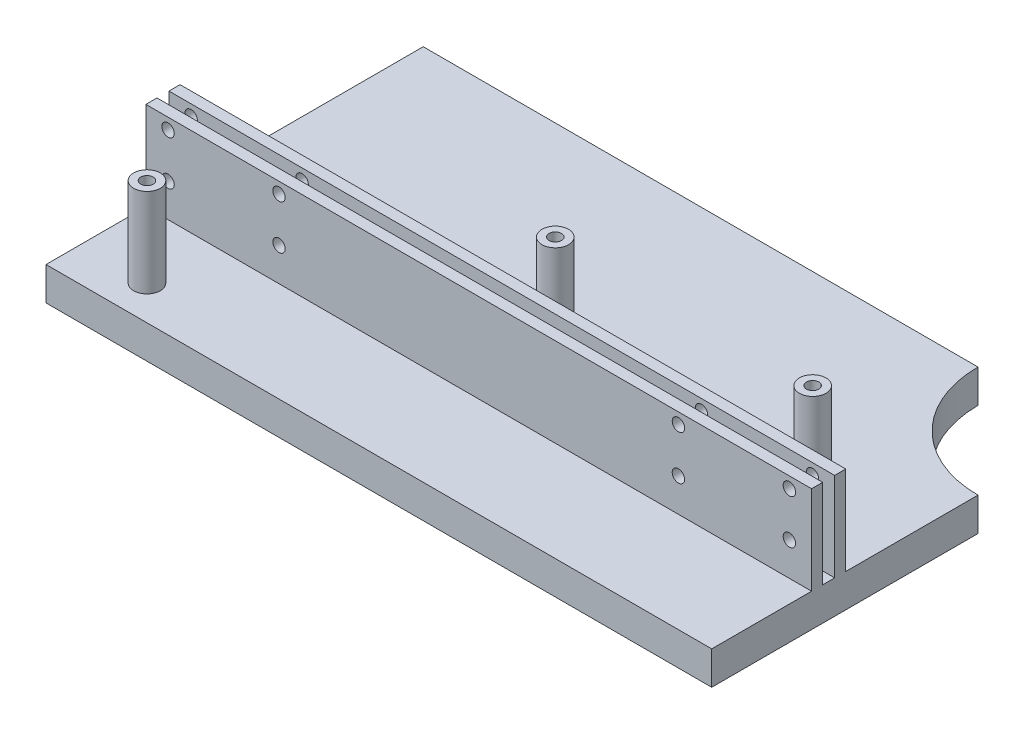
ISO-10303-21;
HEADER;
FILE_DESCRIPTION(('STEP AP214'),'2;1');
FILE_NAME('part.step','',(''),(''),'','','');
FILE_SCHEMA(('AUTOMOTIVE_DESIGN { 1 0 10303 214 1 1 1 1 }'));
ENDSEC;
DATA;
#1=APPLICATION_CONTEXT('core data for automotive mechanical design processes');
#2=APPLICATION_PROTOCOL_DEFINITION('international standard','automotive_design',2000,#1);
#3=PRODUCT_CONTEXT('',#1,'mechanical');
#4=PRODUCT('Part','Part','',(#3));
#5=PRODUCT_RELATED_PRODUCT_CATEGORY('part','',(#4));
#6=PRODUCT_DEFINITION_FORMATION('','',#4);
#7=PRODUCT_DEFINITION_CONTEXT('part definition',#1,'design');
#8=PRODUCT_DEFINITION('design','',#6,#7);
#9=PRODUCT_DEFINITION_SHAPE('','',#8);
#10=(LENGTH_UNIT() NAMED_UNIT(*) SI_UNIT(.MILLI.,.METRE.));
#11=(NAMED_UNIT(*) PLANE_ANGLE_UNIT() SI_UNIT($,.RADIAN.));
#12=(NAMED_UNIT(*) SI_UNIT($,.STERADIAN.) SOLID_ANGLE_UNIT());
#13=UNCERTAINTY_MEASURE_WITH_UNIT(LENGTH_MEASURE(1.E-05),#10,'distance_accuracy_value','');
#14=(GEOMETRIC_REPRESENTATION_CONTEXT(3) GLOBAL_UNCERTAINTY_ASSIGNED_CONTEXT((#13)) GLOBAL_UNIT_ASSIGNED_CONTEXT((#10,
#11,#12)) REPRESENTATION_CONTEXT('',''));
#15=CARTESIAN_POINT('',(0.,0.,0.));
#16=DIRECTION('',(0.,0.,1.));
#17=DIRECTION('',(1.,0.,0.));
#18=AXIS2_PLACEMENT_3D('',#15,#16,#17);
#19=CARTESIAN_POINT('',(0.,7.5,-85.));
#20=DIRECTION('',(0.,1.,0.));
#21=DIRECTION('',(0.,0.,1.));
#22=AXIS2_PLACEMENT_3D('',#19,#20,#21);
#23=PLANE('',#22);
#24=CARTESIAN_POINT('',(-135.,7.5,-7.75));
#25=DIRECTION('',(0.,1.,0.));
#26=DIRECTION('',(0.,0.,1.));
#27=AXIS2_PLACEMENT_3D('',#24,#25,#26);
#28=CIRCLE('',#27,2.99999999999999);
#29=CARTESIAN_POINT('',(-135.,7.5,-4.75000000000001));
#30=VERTEX_POINT('',#29);
#31=EDGE_CURVE('E639',#30,#30,#28,.T.);
#32=ORIENTED_EDGE('',*,*,#31,.F.);
#33=EDGE_LOOP('',(#32));
#34=FACE_BOUND('',#33,.T.);
#35=DIRECTION('',(1.,0.,0.));
#36=VECTOR('',#35,1.);
#37=CARTESIAN_POINT('',(0.,7.5,-22.5));
#38=LINE('',#37,#36);
#39=CARTESIAN_POINT('',(-150.,7.5,-22.5));
#40=VERTEX_POINT('',#39);
#41=CARTESIAN_POINT('',(0.,7.5,-22.5));
#42=VERTEX_POINT('',#41);
#43=EDGE_CURVE('E153',#40,#42,#38,.T.);
#44=ORIENTED_EDGE('',*,*,#43,.F.);
#45=DIRECTION('',(0.,0.,1.));
#46=VECTOR('',#45,1.);
#47=CARTESIAN_POINT('',(-150.,7.5,-85.));
#48=LINE('',#47,#46);
#49=CARTESIAN_POINT('',(-150.,7.5,0.));
#50=VERTEX_POINT('',#49);
#51=EDGE_CURVE('E196',#40,#50,#48,.T.);
#52=ORIENTED_EDGE('',*,*,#51,.T.);
#53=DIRECTION('',(1.,0.,0.));
#54=VECTOR('',#53,1.);
#55=CARTESIAN_POINT('',(-150.,7.5,0.));
#56=LINE('',#55,#54);
#57=CARTESIAN_POINT('',(0.,7.5,0.));
#58=VERTEX_POINT('',#57);
#59=EDGE_CURVE('E194',#50,#58,#56,.T.);
#60=ORIENTED_EDGE('',*,*,#59,.T.);
#61=DIRECTION('',(0.,0.,-1.));
#62=VECTOR('',#61,1.);
#63=CARTESIAN_POINT('',(0.,7.5,-60.));
#64=LINE('',#63,#62);
#65=EDGE_CURVE('E199',#58,#42,#64,.T.);
#66=ORIENTED_EDGE('',*,*,#65,.T.);
#67=EDGE_LOOP('',(#44,#52,#60,#66));
#68=FACE_BOUND('',#67,.T.);
#69=ADVANCED_FACE('F39',(#34,#68),#23,.T.);
#70=CARTESIAN_POINT('',(-20.,7.5,-42.75));
#71=DIRECTION('',(0.,1.,0.));
#72=DIRECTION('',(0.,0.,1.));
#73=AXIS2_PLACEMENT_3D('',#70,#71,#72);
#74=CIRCLE('',#73,3.);
#75=CARTESIAN_POINT('',(-20.,7.5,-39.75));
#76=VERTEX_POINT('',#75);
#77=EDGE_CURVE('E652',#76,#76,#74,.T.);
#78=ORIENTED_EDGE('',*,*,#77,.F.);
#79=EDGE_LOOP('',(#78));
#80=FACE_BOUND('',#79,.T.);
#81=CARTESIAN_POINT('',(-78.,7.5,-42.75));
#82=DIRECTION('',(0.,1.,0.));
#83=DIRECTION('',(0.,0.,1.));
#84=AXIS2_PLACEMENT_3D('',#81,#82,#83);
#85=CIRCLE('',#84,3.00000000000001);
#86=CARTESIAN_POINT('',(-78.,7.5,-39.75));
#87=VERTEX_POINT('',#86);
#88=EDGE_CURVE('E655',#87,#87,#85,.T.);
#89=ORIENTED_EDGE('',*,*,#88,.F.);
#90=EDGE_LOOP('',(#89));
#91=FACE_BOUND('',#90,.T.);
#92=DIRECTION('',(-1.,0.,0.));
#93=VECTOR('',#92,1.);
#94=CARTESIAN_POINT('',(-150.,7.5,-30.2));
#95=LINE('',#94,#93);
#96=CARTESIAN_POINT('',(0.,7.5,-30.2));
#97=VERTEX_POINT('',#96);
#98=CARTESIAN_POINT('',(-150.,7.5,-30.2));
#99=VERTEX_POINT('',#98);
#100=EDGE_CURVE('E54',#97,#99,#95,.T.);
#101=ORIENTED_EDGE('',*,*,#100,.F.);
#102=CARTESIAN_POINT('',(0.,7.5,-60.));
#103=VERTEX_POINT('',#102);
#104=EDGE_CURVE('E198',#97,#103,#64,.T.);
#105=ORIENTED_EDGE('',*,*,#104,.T.);
#106=CARTESIAN_POINT('',(0.,7.5,-85.));
#107=DIRECTION('',(0.,-1.,0.));
#108=DIRECTION('',(0.,0.,1.));
#109=AXIS2_PLACEMENT_3D('',#106,#107,#108);
#110=CIRCLE('',#109,25.);
#111=CARTESIAN_POINT('',(-25.,7.5,-85.));
#112=VERTEX_POINT('',#111);
#113=EDGE_CURVE('E201',#103,#112,#110,.T.);
#114=ORIENTED_EDGE('',*,*,#113,.T.);
#115=DIRECTION('',(-1.,0.,0.));
#116=VECTOR('',#115,1.);
#117=CARTESIAN_POINT('',(-150.,7.5,-85.));
#118=LINE('',#117,#116);
#119=CARTESIAN_POINT('',(-150.,7.5,-85.));
#120=VERTEX_POINT('',#119);
#121=EDGE_CURVE('E203',#112,#120,#118,.T.);
#122=ORIENTED_EDGE('',*,*,#121,.T.);
#123=EDGE_CURVE('E192',#120,#99,#48,.T.);
#124=ORIENTED_EDGE('',*,*,#123,.T.);
#125=EDGE_LOOP('',(#101,#105,#114,#122,#124));
#126=FACE_BOUND('',#125,.T.);
#127=ADVANCED_FACE('F241',(#80,#91,#126),#23,.T.);
#128=CARTESIAN_POINT('',(-150.,7.5,-85.));
#129=DIRECTION('',(1.,0.,0.));
#130=DIRECTION('',(0.,0.,-1.));
#131=AXIS2_PLACEMENT_3D('',#128,#129,#130);
#132=PLANE('',#131);
#133=DIRECTION('',(0.,0.,1.));
#134=VECTOR('',#133,1.);
#135=CARTESIAN_POINT('',(-150.,0.,-85.));
#136=LINE('',#135,#134);
#137=CARTESIAN_POINT('',(-150.,0.,-85.));
#138=VERTEX_POINT('',#137);
#139=CARTESIAN_POINT('',(-150.,0.,0.));
#140=VERTEX_POINT('',#139);
#141=EDGE_CURVE('E158',#138,#140,#136,.T.);
#142=ORIENTED_EDGE('',*,*,#141,.T.);
#143=DIRECTION('',(0.,-1.,0.));
#144=VECTOR('',#143,1.);
#145=CARTESIAN_POINT('',(-150.,7.5,0.));
#146=LINE('',#145,#144);
#147=EDGE_CURVE('E11',#50,#140,#146,.T.);
#148=ORIENTED_EDGE('',*,*,#147,.F.);
#149=ORIENTED_EDGE('',*,*,#51,.F.);
#150=DIRECTION('',(0.,-1.,0.));
#151=VECTOR('',#150,1.);
#152=CARTESIAN_POINT('',(-150.,27.5,-22.5));
#153=LINE('',#152,#151);
#154=CARTESIAN_POINT('',(-150.,27.5,-22.5));
#155=VERTEX_POINT('',#154);
#156=EDGE_CURVE('E163',#155,#40,#153,.T.);
#157=ORIENTED_EDGE('',*,*,#156,.F.);
#158=DIRECTION('',(0.,0.,1.));
#159=VECTOR('',#158,1.);
#160=CARTESIAN_POINT('',(-150.,27.5,-25.));
#161=LINE('',#160,#159);
#162=CARTESIAN_POINT('',(-150.,27.5,-25.));
#163=VERTEX_POINT('',#162);
#164=EDGE_CURVE('E143',#163,#155,#161,.T.);
#165=ORIENTED_EDGE('',*,*,#164,.F.);
#166=DIRECTION('',(0.,-1.,0.));
#167=VECTOR('',#166,1.);
#168=CARTESIAN_POINT('',(-150.,27.5,-25.));
#169=LINE('',#168,#167);
#170=CARTESIAN_POINT('',(-150.,7.5,-25.));
#171=VERTEX_POINT('',#170);
#172=EDGE_CURVE('E140',#163,#171,#169,.T.);
#173=ORIENTED_EDGE('',*,*,#172,.T.);
#174=CARTESIAN_POINT('',(-150.,7.5,-27.7));
#175=VERTEX_POINT('',#174);
#176=EDGE_CURVE('E195',#175,#171,#48,.T.);
#177=ORIENTED_EDGE('',*,*,#176,.F.);
#178=DIRECTION('',(0.,-1.,0.));
#179=VECTOR('',#178,1.);
#180=CARTESIAN_POINT('',(-150.,27.5,-27.7));
#181=LINE('',#180,#179);
#182=CARTESIAN_POINT('',(-150.,27.5,-27.7));
#183=VERTEX_POINT('',#182);
#184=EDGE_CURVE('E167',#183,#175,#181,.T.);
#185=ORIENTED_EDGE('',*,*,#184,.F.);
#186=DIRECTION('',(0.,0.,1.));
#187=VECTOR('',#186,1.);
#188=CARTESIAN_POINT('',(-150.,27.5,-27.7));
#189=LINE('',#188,#187);
#190=CARTESIAN_POINT('',(-150.,27.5,-30.2));
#191=VERTEX_POINT('',#190);
#192=EDGE_CURVE('E182',#191,#183,#189,.T.);
#193=ORIENTED_EDGE('',*,*,#192,.F.);
#194=DIRECTION('',(0.,-1.,0.));
#195=VECTOR('',#194,1.);
#196=CARTESIAN_POINT('',(-150.,27.5,-30.2));
#197=LINE('',#196,#195);
#198=EDGE_CURVE('E176',#191,#99,#197,.T.);
#199=ORIENTED_EDGE('',*,*,#198,.T.);
#200=ORIENTED_EDGE('',*,*,#123,.F.);
#201=DIRECTION('',(0.,-1.,0.));
#202=VECTOR('',#201,1.);
#203=CARTESIAN_POINT('',(-150.,7.5,-85.));
#204=LINE('',#203,#202);
#205=EDGE_CURVE('E204',#120,#138,#204,.T.);
#206=ORIENTED_EDGE('',*,*,#205,.T.);
#207=EDGE_LOOP('',(#142,#148,#149,#157,#165,#173,#177,#185,#193,#199,#200,#206));
#208=FACE_BOUND('',#207,.T.);
#209=ADVANCED_FACE('F41',(#208),#132,.F.);
#210=CARTESIAN_POINT('',(-150.,7.5,0.));
#211=DIRECTION('',(0.,0.,-1.));
#212=DIRECTION('',(-1.,0.,0.));
#213=AXIS2_PLACEMENT_3D('',#210,#211,#212);
#214=PLANE('',#213);
#215=DIRECTION('',(1.,0.,0.));
#216=VECTOR('',#215,1.);
#217=CARTESIAN_POINT('',(-150.,0.,0.));
#218=LINE('',#217,#216);
#219=CARTESIAN_POINT('',(0.,0.,0.));
#220=VERTEX_POINT('',#219);
#221=EDGE_CURVE('E161',#140,#220,#218,.T.);
#222=ORIENTED_EDGE('',*,*,#221,.T.);
#223=DIRECTION('',(0.,-1.,0.));
#224=VECTOR('',#223,1.);
#225=CARTESIAN_POINT('',(0.,7.5,0.));
#226=LINE('',#225,#224);
#227=EDGE_CURVE('E47',#58,#220,#226,.T.);
#228=ORIENTED_EDGE('',*,*,#227,.F.);
#229=ORIENTED_EDGE('',*,*,#59,.F.);
#230=ORIENTED_EDGE('',*,*,#147,.T.);
#231=EDGE_LOOP('',(#222,#228,#229,#230));
#232=FACE_BOUND('',#231,.T.);
#233=ADVANCED_FACE('F262',(#232),#214,.F.);
#234=CARTESIAN_POINT('',(0.,7.5,-60.));
#235=DIRECTION('',(-1.,0.,0.));
#236=DIRECTION('',(0.,0.,1.));
#237=AXIS2_PLACEMENT_3D('',#234,#235,#236);
#238=PLANE('',#237);
#239=DIRECTION('',(0.,0.,-1.));
#240=VECTOR('',#239,1.);
#241=CARTESIAN_POINT('',(0.,0.,-60.));
#242=LINE('',#241,#240);
#243=CARTESIAN_POINT('',(0.,0.,-60.));
#244=VERTEX_POINT('',#243);
#245=EDGE_CURVE('E207',#220,#244,#242,.T.);
#246=ORIENTED_EDGE('',*,*,#245,.T.);
#247=DIRECTION('',(0.,-1.,0.));
#248=VECTOR('',#247,1.);
#249=CARTESIAN_POINT('',(0.,7.5,-60.));
#250=LINE('',#249,#248);
#251=EDGE_CURVE('E218',#103,#244,#250,.T.);
#252=ORIENTED_EDGE('',*,*,#251,.F.);
#253=ORIENTED_EDGE('',*,*,#104,.F.);
#254=DIRECTION('',(0.,-1.,0.));
#255=VECTOR('',#254,1.);
#256=CARTESIAN_POINT('',(0.,27.5,-30.2));
#257=LINE('',#256,#255);
#258=CARTESIAN_POINT('',(0.,27.5,-30.2));
#259=VERTEX_POINT('',#258);
#260=EDGE_CURVE('E173',#259,#97,#257,.T.);
#261=ORIENTED_EDGE('',*,*,#260,.F.);
#262=DIRECTION('',(0.,0.,-1.));
#263=VECTOR('',#262,1.);
#264=CARTESIAN_POINT('',(0.,27.5,-27.7));
#265=LINE('',#264,#263);
#266=CARTESIAN_POINT('',(0.,27.5,-27.7));
#267=VERTEX_POINT('',#266);
#268=EDGE_CURVE('E186',#267,#259,#265,.T.);
#269=ORIENTED_EDGE('',*,*,#268,.F.);
#270=DIRECTION('',(0.,-1.,0.));
#271=VECTOR('',#270,1.);
#272=CARTESIAN_POINT('',(0.,27.5,-27.7));
#273=LINE('',#272,#271);
#274=CARTESIAN_POINT('',(0.,7.5,-27.7));
#275=VERTEX_POINT('',#274);
#276=EDGE_CURVE('E170',#267,#275,#273,.T.);
#277=ORIENTED_EDGE('',*,*,#276,.T.);
#278=CARTESIAN_POINT('',(0.,7.5,-25.));
#279=VERTEX_POINT('',#278);
#280=EDGE_CURVE('E157',#279,#275,#64,.T.);
#281=ORIENTED_EDGE('',*,*,#280,.F.);
#282=DIRECTION('',(0.,-1.,0.));
#283=VECTOR('',#282,1.);
#284=CARTESIAN_POINT('',(0.,27.5,-25.));
#285=LINE('',#284,#283);
#286=CARTESIAN_POINT('',(0.,27.5,-25.));
#287=VERTEX_POINT('',#286);
#288=EDGE_CURVE('E138',#287,#279,#285,.T.);
#289=ORIENTED_EDGE('',*,*,#288,.F.);
#290=DIRECTION('',(0.,0.,-1.));
#291=VECTOR('',#290,1.);
#292=CARTESIAN_POINT('',(0.,27.5,-25.));
#293=LINE('',#292,#291);
#294=CARTESIAN_POINT('',(0.,27.5,-22.5));
#295=VERTEX_POINT('',#294);
#296=EDGE_CURVE('E144',#295,#287,#293,.T.);
#297=ORIENTED_EDGE('',*,*,#296,.F.);
#298=DIRECTION('',(0.,-1.,0.));
#299=VECTOR('',#298,1.);
#300=CARTESIAN_POINT('',(0.,27.5,-22.5));
#301=LINE('',#300,#299);
#302=EDGE_CURVE('E758',#295,#42,#301,.T.);
#303=ORIENTED_EDGE('',*,*,#302,.T.);
#304=ORIENTED_EDGE('',*,*,#65,.F.);
#305=ORIENTED_EDGE('',*,*,#227,.T.);
#306=EDGE_LOOP('',(#246,#252,#253,#261,#269,#277,#281,#289,#297,#303,#304,#305));
#307=FACE_BOUND('',#306,.T.);
#308=ADVANCED_FACE('F155',(#307),#238,.F.);
#309=CARTESIAN_POINT('',(0.,7.5,-85.));
#310=DIRECTION('',(0.,-1.,0.));
#311=DIRECTION('',(0.,0.,-1.));
#312=AXIS2_PLACEMENT_3D('',#309,#310,#311);
#313=CYLINDRICAL_SURFACE('',#312,25.);
#314=CARTESIAN_POINT('',(0.,0.,-85.));
#315=DIRECTION('',(0.,-1.,0.));
#316=DIRECTION('',(0.,0.,1.));
#317=AXIS2_PLACEMENT_3D('',#314,#315,#316);
#318=CIRCLE('',#317,25.);
#319=CARTESIAN_POINT('',(-25.,0.,-85.));
#320=VERTEX_POINT('',#319);
#321=EDGE_CURVE('E209',#244,#320,#318,.T.);
#322=ORIENTED_EDGE('',*,*,#321,.T.);
#323=DIRECTION('',(0.,-1.,0.));
#324=VECTOR('',#323,1.);
#325=CARTESIAN_POINT('',(-25.,7.5,-85.));
#326=LINE('',#325,#324);
#327=EDGE_CURVE('E215',#112,#320,#326,.T.);
#328=ORIENTED_EDGE('',*,*,#327,.F.);
#329=ORIENTED_EDGE('',*,*,#113,.F.);
#330=ORIENTED_EDGE('',*,*,#251,.T.);
#331=EDGE_LOOP('',(#322,#328,#329,#330));
#332=FACE_BOUND('',#331,.T.);
#333=ADVANCED_FACE('F234',(#332),#313,.F.);
#334=CARTESIAN_POINT('',(-150.,7.5,-85.));
#335=DIRECTION('',(0.,0.,1.));
#336=DIRECTION('',(1.,0.,0.));
#337=AXIS2_PLACEMENT_3D('',#334,#335,#336);
#338=PLANE('',#337);
#339=DIRECTION('',(-1.,0.,0.));
#340=VECTOR('',#339,1.);
#341=CARTESIAN_POINT('',(-150.,0.,-85.));
#342=LINE('',#341,#340);
#343=EDGE_CURVE('E211',#320,#138,#342,.T.);
#344=ORIENTED_EDGE('',*,*,#343,.T.);
#345=ORIENTED_EDGE('',*,*,#205,.F.);
#346=ORIENTED_EDGE('',*,*,#121,.F.);
#347=ORIENTED_EDGE('',*,*,#327,.T.);
#348=EDGE_LOOP('',(#344,#345,#346,#347));
#349=FACE_BOUND('',#348,.T.);
#350=ADVANCED_FACE('F238',(#349),#338,.F.);
#351=DIRECTION('',(-1.,0.,0.));
#352=VECTOR('',#351,1.);
#353=CARTESIAN_POINT('',(0.,7.5,-25.));
#354=LINE('',#353,#352);
#355=EDGE_CURVE('E62',#279,#171,#354,.T.);
#356=ORIENTED_EDGE('',*,*,#355,.F.);
#357=ORIENTED_EDGE('',*,*,#280,.T.);
#358=DIRECTION('',(1.,0.,0.));
#359=VECTOR('',#358,1.);
#360=CARTESIAN_POINT('',(-150.,7.5,-27.7));
#361=LINE('',#360,#359);
#362=EDGE_CURVE('E181',#175,#275,#361,.T.);
#363=ORIENTED_EDGE('',*,*,#362,.F.);
#364=ORIENTED_EDGE('',*,*,#176,.T.);
#365=EDGE_LOOP('',(#356,#357,#363,#364));
#366=FACE_BOUND('',#365,.T.);
#367=ADVANCED_FACE('F243',(#366),#23,.T.);
#368=CARTESIAN_POINT('',(0.,0.,-85.));
#369=DIRECTION('',(0.,1.,0.));
#370=DIRECTION('',(0.,0.,1.));
#371=AXIS2_PLACEMENT_3D('',#368,#369,#370);
#372=PLANE('',#371);
#373=ORIENTED_EDGE('',*,*,#141,.F.);
#374=ORIENTED_EDGE('',*,*,#343,.F.);
#375=ORIENTED_EDGE('',*,*,#321,.F.);
#376=ORIENTED_EDGE('',*,*,#245,.F.);
#377=ORIENTED_EDGE('',*,*,#221,.F.);
#378=EDGE_LOOP('',(#373,#374,#375,#376,#377));
#379=FACE_BOUND('',#378,.T.);
#380=ADVANCED_FACE('F230',(#379),#372,.F.);
#381=CARTESIAN_POINT('',(-150.,27.5,-27.7));
#382=DIRECTION('',(0.,0.,-1.));
#383=DIRECTION('',(-1.,0.,0.));
#384=AXIS2_PLACEMENT_3D('',#381,#382,#383);
#385=PLANE('',#384);
#386=CARTESIAN_POINT('',(-145.,15.,-27.7));
#387=DIRECTION('',(0.,0.,-1.));
#388=DIRECTION('',(-1.,0.,0.));
#389=AXIS2_PLACEMENT_3D('',#386,#387,#388);
#390=CIRCLE('',#389,1.4);
#391=CARTESIAN_POINT('',(-146.4,15.,-27.7));
#392=VERTEX_POINT('',#391);
#393=EDGE_CURVE('E171',#392,#392,#390,.T.);
#394=ORIENTED_EDGE('',*,*,#393,.T.);
#395=EDGE_LOOP('',(#394));
#396=FACE_BOUND('',#395,.T.);
#397=CARTESIAN_POINT('',(-5.,15.,-27.7));
#398=DIRECTION('',(0.,0.,-1.));
#399=DIRECTION('',(-1.,0.,0.));
#400=AXIS2_PLACEMENT_3D('',#397,#398,#399);
#401=CIRCLE('',#400,1.4);
#402=CARTESIAN_POINT('',(-6.4,15.,-27.7));
#403=VERTEX_POINT('',#402);
#404=EDGE_CURVE('E746',#403,#403,#401,.T.);
#405=ORIENTED_EDGE('',*,*,#404,.T.);
#406=EDGE_LOOP('',(#405));
#407=FACE_BOUND('',#406,.T.);
#408=CARTESIAN_POINT('',(-30.,15.,-27.7));
#409=DIRECTION('',(0.,0.,-1.));
#410=DIRECTION('',(-1.,0.,0.));
#411=AXIS2_PLACEMENT_3D('',#408,#409,#410);
#412=CIRCLE('',#411,1.4);
#413=CARTESIAN_POINT('',(-31.4,15.,-27.7));
#414=VERTEX_POINT('',#413);
#415=EDGE_CURVE('E737',#414,#414,#412,.T.);
#416=ORIENTED_EDGE('',*,*,#415,.T.);
#417=EDGE_LOOP('',(#416));
#418=FACE_BOUND('',#417,.T.);
#419=CARTESIAN_POINT('',(-5.00000000000001,25.,-27.7));
#420=DIRECTION('',(0.,0.,-1.));
#421=DIRECTION('',(-1.,0.,0.));
#422=AXIS2_PLACEMENT_3D('',#419,#420,#421);
#423=CIRCLE('',#422,1.4);
#424=CARTESIAN_POINT('',(-6.40000000000001,25.,-27.7));
#425=VERTEX_POINT('',#424);
#426=EDGE_CURVE('E728',#425,#425,#423,.T.);
#427=ORIENTED_EDGE('',*,*,#426,.T.);
#428=EDGE_LOOP('',(#427));
#429=FACE_BOUND('',#428,.T.);
#430=CARTESIAN_POINT('',(-120.,25.,-27.7));
#431=DIRECTION('',(0.,0.,-1.));
#432=DIRECTION('',(-1.,0.,0.));
#433=AXIS2_PLACEMENT_3D('',#430,#431,#432);
#434=CIRCLE('',#433,1.4);
#435=CARTESIAN_POINT('',(-121.4,25.,-27.7));
#436=VERTEX_POINT('',#435);
#437=EDGE_CURVE('E719',#436,#436,#434,.T.);
#438=ORIENTED_EDGE('',*,*,#437,.T.);
#439=EDGE_LOOP('',(#438));
#440=FACE_BOUND('',#439,.T.);
#441=CARTESIAN_POINT('',(-145.,25.,-27.7));
#442=DIRECTION('',(0.,0.,-1.));
#443=DIRECTION('',(-1.,0.,0.));
#444=AXIS2_PLACEMENT_3D('',#441,#442,#443);
#445=CIRCLE('',#444,1.4);
#446=CARTESIAN_POINT('',(-146.4,25.,-27.7));
#447=VERTEX_POINT('',#446);
#448=EDGE_CURVE('E710',#447,#447,#445,.T.);
#449=ORIENTED_EDGE('',*,*,#448,.T.);
#450=EDGE_LOOP('',(#449));
#451=FACE_BOUND('',#450,.T.);
#452=CARTESIAN_POINT('',(-120.,15.,-27.7));
#453=DIRECTION('',(0.,0.,-1.));
#454=DIRECTION('',(-1.,0.,0.));
#455=AXIS2_PLACEMENT_3D('',#452,#453,#454);
#456=CIRCLE('',#455,1.4);
#457=CARTESIAN_POINT('',(-121.4,15.,-27.7));
#458=VERTEX_POINT('',#457);
#459=EDGE_CURVE('E701',#458,#458,#456,.T.);
#460=ORIENTED_EDGE('',*,*,#459,.T.);
#461=EDGE_LOOP('',(#460));
#462=FACE_BOUND('',#461,.T.);
#463=CARTESIAN_POINT('',(-30.,25.,-27.7));
#464=DIRECTION('',(0.,0.,-1.));
#465=DIRECTION('',(-1.,0.,0.));
#466=AXIS2_PLACEMENT_3D('',#463,#464,#465);
#467=CIRCLE('',#466,1.4);
#468=CARTESIAN_POINT('',(-31.4,25.,-27.7));
#469=VERTEX_POINT('',#468);
#470=EDGE_CURVE('E692',#469,#469,#467,.T.);
#471=ORIENTED_EDGE('',*,*,#470,.T.);
#472=EDGE_LOOP('',(#471));
#473=FACE_BOUND('',#472,.T.);
#474=ORIENTED_EDGE('',*,*,#362,.T.);
#475=ORIENTED_EDGE('',*,*,#276,.F.);
#476=DIRECTION('',(1.,0.,0.));
#477=VECTOR('',#476,1.);
#478=CARTESIAN_POINT('',(-150.,27.5,-27.7));
#479=LINE('',#478,#477);
#480=EDGE_CURVE('E188',#183,#267,#479,.T.);
#481=ORIENTED_EDGE('',*,*,#480,.F.);
#482=ORIENTED_EDGE('',*,*,#184,.T.);
#483=EDGE_LOOP('',(#474,#475,#481,#482));
#484=FACE_BOUND('',#483,.T.);
#485=ADVANCED_FACE('F247',(#396,#407,#418,#429,#440,#451,#462,#473,#484),#385,.F.);
#486=CARTESIAN_POINT('',(-150.,27.5,-30.2));
#487=DIRECTION('',(0.,0.,1.));
#488=DIRECTION('',(1.,0.,0.));
#489=AXIS2_PLACEMENT_3D('',#486,#487,#488);
#490=PLANE('',#489);
#491=CARTESIAN_POINT('',(-145.,15.,-30.2));
#492=DIRECTION('',(0.,0.,1.));
#493=DIRECTION('',(1.,0.,0.));
#494=AXIS2_PLACEMENT_3D('',#491,#492,#493);
#495=CIRCLE('',#494,1.4);
#496=CARTESIAN_POINT('',(-143.6,15.,-30.2));
#497=VERTEX_POINT('',#496);
#498=EDGE_CURVE('E752',#497,#497,#495,.T.);
#499=ORIENTED_EDGE('',*,*,#498,.T.);
#500=EDGE_LOOP('',(#499));
#501=FACE_BOUND('',#500,.T.);
#502=CARTESIAN_POINT('',(-5.,15.,-30.2));
#503=DIRECTION('',(0.,0.,1.));
#504=DIRECTION('',(1.,0.,0.));
#505=AXIS2_PLACEMENT_3D('',#502,#503,#504);
#506=CIRCLE('',#505,1.4);
#507=CARTESIAN_POINT('',(-3.6,15.,-30.2));
#508=VERTEX_POINT('',#507);
#509=EDGE_CURVE('E743',#508,#508,#506,.T.);
#510=ORIENTED_EDGE('',*,*,#509,.T.);
#511=EDGE_LOOP('',(#510));
#512=FACE_BOUND('',#511,.T.);
#513=CARTESIAN_POINT('',(-30.,15.,-30.2));
#514=DIRECTION('',(0.,0.,1.));
#515=DIRECTION('',(1.,0.,0.));
#516=AXIS2_PLACEMENT_3D('',#513,#514,#515);
#517=CIRCLE('',#516,1.4);
#518=CARTESIAN_POINT('',(-28.6,15.,-30.2));
#519=VERTEX_POINT('',#518);
#520=EDGE_CURVE('E734',#519,#519,#517,.T.);
#521=ORIENTED_EDGE('',*,*,#520,.T.);
#522=EDGE_LOOP('',(#521));
#523=FACE_BOUND('',#522,.T.);
#524=CARTESIAN_POINT('',(-5.00000000000001,25.,-30.2));
#525=DIRECTION('',(0.,0.,1.));
#526=DIRECTION('',(1.,0.,0.));
#527=AXIS2_PLACEMENT_3D('',#524,#525,#526);
#528=CIRCLE('',#527,1.4);
#529=CARTESIAN_POINT('',(-3.60000000000001,25.,-30.2));
#530=VERTEX_POINT('',#529);
#531=EDGE_CURVE('E725',#530,#530,#528,.T.);
#532=ORIENTED_EDGE('',*,*,#531,.T.);
#533=EDGE_LOOP('',(#532));
#534=FACE_BOUND('',#533,.T.);
#535=CARTESIAN_POINT('',(-120.,25.,-30.2));
#536=DIRECTION('',(0.,0.,1.));
#537=DIRECTION('',(1.,0.,0.));
#538=AXIS2_PLACEMENT_3D('',#535,#536,#537);
#539=CIRCLE('',#538,1.4);
#540=CARTESIAN_POINT('',(-118.6,25.,-30.2));
#541=VERTEX_POINT('',#540);
#542=EDGE_CURVE('E716',#541,#541,#539,.T.);
#543=ORIENTED_EDGE('',*,*,#542,.T.);
#544=EDGE_LOOP('',(#543));
#545=FACE_BOUND('',#544,.T.);
#546=CARTESIAN_POINT('',(-145.,25.,-30.2));
#547=DIRECTION('',(0.,0.,1.));
#548=DIRECTION('',(1.,0.,0.));
#549=AXIS2_PLACEMENT_3D('',#546,#547,#548);
#550=CIRCLE('',#549,1.4);
#551=CARTESIAN_POINT('',(-143.6,25.,-30.2));
#552=VERTEX_POINT('',#551);
#553=EDGE_CURVE('E707',#552,#552,#550,.T.);
#554=ORIENTED_EDGE('',*,*,#553,.T.);
#555=EDGE_LOOP('',(#554));
#556=FACE_BOUND('',#555,.T.);
#557=CARTESIAN_POINT('',(-120.,15.,-30.2));
#558=DIRECTION('',(0.,0.,1.));
#559=DIRECTION('',(1.,0.,0.));
#560=AXIS2_PLACEMENT_3D('',#557,#558,#559);
#561=CIRCLE('',#560,1.4);
#562=CARTESIAN_POINT('',(-118.6,15.,-30.2));
#563=VERTEX_POINT('',#562);
#564=EDGE_CURVE('E698',#563,#563,#561,.T.);
#565=ORIENTED_EDGE('',*,*,#564,.T.);
#566=EDGE_LOOP('',(#565));
#567=FACE_BOUND('',#566,.T.);
#568=CARTESIAN_POINT('',(-30.,25.,-30.2));
#569=DIRECTION('',(0.,0.,1.));
#570=DIRECTION('',(1.,0.,0.));
#571=AXIS2_PLACEMENT_3D('',#568,#569,#570);
#572=CIRCLE('',#571,1.4);
#573=CARTESIAN_POINT('',(-28.6,25.,-30.2));
#574=VERTEX_POINT('',#573);
#575=EDGE_CURVE('E689',#574,#574,#572,.T.);
#576=ORIENTED_EDGE('',*,*,#575,.T.);
#577=EDGE_LOOP('',(#576));
#578=FACE_BOUND('',#577,.T.);
#579=ORIENTED_EDGE('',*,*,#100,.T.);
#580=ORIENTED_EDGE('',*,*,#198,.F.);
#581=DIRECTION('',(-1.,0.,0.));
#582=VECTOR('',#581,1.);
#583=CARTESIAN_POINT('',(-150.,27.5,-30.2));
#584=LINE('',#583,#582);
#585=EDGE_CURVE('E179',#259,#191,#584,.T.);
#586=ORIENTED_EDGE('',*,*,#585,.F.);
#587=ORIENTED_EDGE('',*,*,#260,.T.);
#588=EDGE_LOOP('',(#579,#580,#586,#587));
#589=FACE_BOUND('',#588,.T.);
#590=ADVANCED_FACE('F264',(#501,#512,#523,#534,#545,#556,#567,#578,#589),#490,.F.);
#591=CARTESIAN_POINT('',(0.,27.5,0.));
#592=DIRECTION('',(0.,-1.,0.));
#593=DIRECTION('',(0.,0.,-1.));
#594=AXIS2_PLACEMENT_3D('',#591,#592,#593);
#595=PLANE('',#594);
#596=ORIENTED_EDGE('',*,*,#192,.T.);
#597=ORIENTED_EDGE('',*,*,#480,.T.);
#598=ORIENTED_EDGE('',*,*,#268,.T.);
#599=ORIENTED_EDGE('',*,*,#585,.T.);
#600=EDGE_LOOP('',(#596,#597,#598,#599));
#601=FACE_BOUND('',#600,.T.);
#602=ADVANCED_FACE('F252',(#601),#595,.F.);
#603=CARTESIAN_POINT('',(0.,27.5,-25.));
#604=DIRECTION('',(0.,0.,1.));
#605=DIRECTION('',(1.,0.,0.));
#606=AXIS2_PLACEMENT_3D('',#603,#604,#605);
#607=PLANE('',#606);
#608=CARTESIAN_POINT('',(-145.,15.,-25.));
#609=DIRECTION('',(0.,0.,1.));
#610=DIRECTION('',(1.,0.,0.));
#611=AXIS2_PLACEMENT_3D('',#608,#609,#610);
#612=CIRCLE('',#611,1.4);
#613=CARTESIAN_POINT('',(-143.6,15.,-25.));
#614=VERTEX_POINT('',#613);
#615=EDGE_CURVE('E749',#614,#614,#612,.T.);
#616=ORIENTED_EDGE('',*,*,#615,.T.);
#617=EDGE_LOOP('',(#616));
#618=FACE_BOUND('',#617,.T.);
#619=CARTESIAN_POINT('',(-5.,15.,-25.));
#620=DIRECTION('',(0.,0.,1.));
#621=DIRECTION('',(1.,0.,0.));
#622=AXIS2_PLACEMENT_3D('',#619,#620,#621);
#623=CIRCLE('',#622,1.4);
#624=CARTESIAN_POINT('',(-3.6,15.,-25.));
#625=VERTEX_POINT('',#624);
#626=EDGE_CURVE('E740',#625,#625,#623,.T.);
#627=ORIENTED_EDGE('',*,*,#626,.T.);
#628=EDGE_LOOP('',(#627));
#629=FACE_BOUND('',#628,.T.);
#630=CARTESIAN_POINT('',(-30.,15.,-25.));
#631=DIRECTION('',(0.,0.,1.));
#632=DIRECTION('',(1.,0.,0.));
#633=AXIS2_PLACEMENT_3D('',#630,#631,#632);
#634=CIRCLE('',#633,1.4);
#635=CARTESIAN_POINT('',(-28.6,15.,-25.));
#636=VERTEX_POINT('',#635);
#637=EDGE_CURVE('E731',#636,#636,#634,.T.);
#638=ORIENTED_EDGE('',*,*,#637,.T.);
#639=EDGE_LOOP('',(#638));
#640=FACE_BOUND('',#639,.T.);
#641=CARTESIAN_POINT('',(-5.00000000000001,25.,-25.));
#642=DIRECTION('',(0.,0.,1.));
#643=DIRECTION('',(1.,0.,0.));
#644=AXIS2_PLACEMENT_3D('',#641,#642,#643);
#645=CIRCLE('',#644,1.4);
#646=CARTESIAN_POINT('',(-3.60000000000001,25.,-25.));
#647=VERTEX_POINT('',#646);
#648=EDGE_CURVE('E722',#647,#647,#645,.T.);
#649=ORIENTED_EDGE('',*,*,#648,.T.);
#650=EDGE_LOOP('',(#649));
#651=FACE_BOUND('',#650,.T.);
#652=CARTESIAN_POINT('',(-120.,25.,-25.));
#653=DIRECTION('',(0.,0.,1.));
#654=DIRECTION('',(1.,0.,0.));
#655=AXIS2_PLACEMENT_3D('',#652,#653,#654);
#656=CIRCLE('',#655,1.4);
#657=CARTESIAN_POINT('',(-118.6,25.,-25.));
#658=VERTEX_POINT('',#657);
#659=EDGE_CURVE('E713',#658,#658,#656,.T.);
#660=ORIENTED_EDGE('',*,*,#659,.T.);
#661=EDGE_LOOP('',(#660));
#662=FACE_BOUND('',#661,.T.);
#663=CARTESIAN_POINT('',(-145.,25.,-25.));
#664=DIRECTION('',(0.,0.,1.));
#665=DIRECTION('',(1.,0.,0.));
#666=AXIS2_PLACEMENT_3D('',#663,#664,#665);
#667=CIRCLE('',#666,1.4);
#668=CARTESIAN_POINT('',(-143.6,25.,-25.));
#669=VERTEX_POINT('',#668);
#670=EDGE_CURVE('E704',#669,#669,#667,.T.);
#671=ORIENTED_EDGE('',*,*,#670,.T.);
#672=EDGE_LOOP('',(#671));
#673=FACE_BOUND('',#672,.T.);
#674=CARTESIAN_POINT('',(-120.,15.,-25.));
#675=DIRECTION('',(0.,0.,1.));
#676=DIRECTION('',(1.,0.,0.));
#677=AXIS2_PLACEMENT_3D('',#674,#675,#676);
#678=CIRCLE('',#677,1.4);
#679=CARTESIAN_POINT('',(-118.6,15.,-25.));
#680=VERTEX_POINT('',#679);
#681=EDGE_CURVE('E695',#680,#680,#678,.T.);
#682=ORIENTED_EDGE('',*,*,#681,.T.);
#683=EDGE_LOOP('',(#682));
#684=FACE_BOUND('',#683,.T.);
#685=CARTESIAN_POINT('',(-30.,25.,-25.));
#686=DIRECTION('',(0.,0.,1.));
#687=DIRECTION('',(1.,0.,0.));
#688=AXIS2_PLACEMENT_3D('',#685,#686,#687);
#689=CIRCLE('',#688,1.4);
#690=CARTESIAN_POINT('',(-28.6,25.,-25.));
#691=VERTEX_POINT('',#690);
#692=EDGE_CURVE('E686',#691,#691,#689,.T.);
#693=ORIENTED_EDGE('',*,*,#692,.T.);
#694=EDGE_LOOP('',(#693));
#695=FACE_BOUND('',#694,.T.);
#696=ORIENTED_EDGE('',*,*,#355,.T.);
#697=ORIENTED_EDGE('',*,*,#172,.F.);
#698=DIRECTION('',(-1.,0.,0.));
#699=VECTOR('',#698,1.);
#700=CARTESIAN_POINT('',(0.,27.5,-25.));
#701=LINE('',#700,#699);
#702=EDGE_CURVE('E134',#287,#163,#701,.T.);
#703=ORIENTED_EDGE('',*,*,#702,.F.);
#704=ORIENTED_EDGE('',*,*,#288,.T.);
#705=EDGE_LOOP('',(#696,#697,#703,#704));
#706=FACE_BOUND('',#705,.T.);
#707=ADVANCED_FACE('F136',(#618,#629,#640,#651,#662,#673,#684,#695,#706),#607,.F.);
#708=CARTESIAN_POINT('',(0.,27.5,-22.5));
#709=DIRECTION('',(0.,0.,-1.));
#710=DIRECTION('',(-1.,0.,0.));
#711=AXIS2_PLACEMENT_3D('',#708,#709,#710);
#712=PLANE('',#711);
#713=CARTESIAN_POINT('',(-145.,15.,-22.5));
#714=DIRECTION('',(0.,0.,1.));
#715=DIRECTION('',(-1.,0.,0.));
#716=AXIS2_PLACEMENT_3D('',#713,#714,#715);
#717=CIRCLE('',#716,1.4);
#718=CARTESIAN_POINT('',(-146.4,15.,-22.5));
#719=VERTEX_POINT('',#718);
#720=EDGE_CURVE('E669',#719,#719,#717,.T.);
#721=ORIENTED_EDGE('',*,*,#720,.F.);
#722=EDGE_LOOP('',(#721));
#723=FACE_BOUND('',#722,.T.);
#724=CARTESIAN_POINT('',(-5.,15.,-22.5));
#725=DIRECTION('',(0.,0.,1.));
#726=DIRECTION('',(1.,0.,0.));
#727=AXIS2_PLACEMENT_3D('',#724,#725,#726);
#728=CIRCLE('',#727,1.4);
#729=CARTESIAN_POINT('',(-3.6,15.,-22.5));
#730=VERTEX_POINT('',#729);
#731=EDGE_CURVE('E672',#730,#730,#728,.T.);
#732=ORIENTED_EDGE('',*,*,#731,.F.);
#733=EDGE_LOOP('',(#732));
#734=FACE_BOUND('',#733,.T.);
#735=CARTESIAN_POINT('',(-30.,15.,-22.5));
#736=DIRECTION('',(0.,0.,1.));
#737=DIRECTION('',(1.,0.,0.));
#738=AXIS2_PLACEMENT_3D('',#735,#736,#737);
#739=CIRCLE('',#738,1.4);
#740=CARTESIAN_POINT('',(-28.6,15.,-22.5));
#741=VERTEX_POINT('',#740);
#742=EDGE_CURVE('E675',#741,#741,#739,.T.);
#743=ORIENTED_EDGE('',*,*,#742,.F.);
#744=EDGE_LOOP('',(#743));
#745=FACE_BOUND('',#744,.T.);
#746=CARTESIAN_POINT('',(-5.00000000000001,25.,-22.5));
#747=DIRECTION('',(0.,0.,1.));
#748=DIRECTION('',(1.,0.,0.));
#749=AXIS2_PLACEMENT_3D('',#746,#747,#748);
#750=CIRCLE('',#749,1.4);
#751=CARTESIAN_POINT('',(-3.60000000000001,25.,-22.5));
#752=VERTEX_POINT('',#751);
#753=EDGE_CURVE('E678',#752,#752,#750,.T.);
#754=ORIENTED_EDGE('',*,*,#753,.F.);
#755=EDGE_LOOP('',(#754));
#756=FACE_BOUND('',#755,.T.);
#757=CARTESIAN_POINT('',(-120.,25.,-22.5));
#758=DIRECTION('',(0.,0.,1.));
#759=DIRECTION('',(-1.,0.,0.));
#760=AXIS2_PLACEMENT_3D('',#757,#758,#759);
#761=CIRCLE('',#760,1.4);
#762=CARTESIAN_POINT('',(-121.4,25.,-22.5));
#763=VERTEX_POINT('',#762);
#764=EDGE_CURVE('E651',#763,#763,#761,.T.);
#765=ORIENTED_EDGE('',*,*,#764,.F.);
#766=EDGE_LOOP('',(#765));
#767=FACE_BOUND('',#766,.T.);
#768=CARTESIAN_POINT('',(-145.,25.,-22.5));
#769=DIRECTION('',(0.,0.,1.));
#770=DIRECTION('',(-1.,0.,0.));
#771=AXIS2_PLACEMENT_3D('',#768,#769,#770);
#772=CIRCLE('',#771,1.4);
#773=CARTESIAN_POINT('',(-146.4,25.,-22.5));
#774=VERTEX_POINT('',#773);
#775=EDGE_CURVE('E665',#774,#774,#772,.T.);
#776=ORIENTED_EDGE('',*,*,#775,.F.);
#777=EDGE_LOOP('',(#776));
#778=FACE_BOUND('',#777,.T.);
#779=CARTESIAN_POINT('',(-120.,15.,-22.5));
#780=DIRECTION('',(0.,0.,1.));
#781=DIRECTION('',(-1.,0.,0.));
#782=AXIS2_PLACEMENT_3D('',#779,#780,#781);
#783=CIRCLE('',#782,1.4);
#784=CARTESIAN_POINT('',(-121.4,15.,-22.5));
#785=VERTEX_POINT('',#784);
#786=EDGE_CURVE('E666',#785,#785,#783,.T.);
#787=ORIENTED_EDGE('',*,*,#786,.F.);
#788=EDGE_LOOP('',(#787));
#789=FACE_BOUND('',#788,.T.);
#790=CARTESIAN_POINT('',(-30.,25.,-22.5));
#791=DIRECTION('',(0.,0.,1.));
#792=DIRECTION('',(1.,0.,0.));
#793=AXIS2_PLACEMENT_3D('',#790,#791,#792);
#794=CIRCLE('',#793,1.4);
#795=CARTESIAN_POINT('',(-28.6,25.,-22.5));
#796=VERTEX_POINT('',#795);
#797=EDGE_CURVE('E681',#796,#796,#794,.T.);
#798=ORIENTED_EDGE('',*,*,#797,.F.);
#799=EDGE_LOOP('',(#798));
#800=FACE_BOUND('',#799,.T.);
#801=ORIENTED_EDGE('',*,*,#43,.T.);
#802=ORIENTED_EDGE('',*,*,#302,.F.);
#803=DIRECTION('',(1.,0.,0.));
#804=VECTOR('',#803,1.);
#805=CARTESIAN_POINT('',(0.,27.5,-22.5));
#806=LINE('',#805,#804);
#807=EDGE_CURVE('E149',#155,#295,#806,.T.);
#808=ORIENTED_EDGE('',*,*,#807,.F.);
#809=ORIENTED_EDGE('',*,*,#156,.T.);
#810=EDGE_LOOP('',(#801,#802,#808,#809));
#811=FACE_BOUND('',#810,.T.);
#812=ADVANCED_FACE('F341',(#723,#734,#745,#756,#767,#778,#789,#800,#811),#712,.F.);
#813=CARTESIAN_POINT('',(0.,27.5,0.));
#814=DIRECTION('',(0.,-1.,0.));
#815=DIRECTION('',(0.,0.,-1.));
#816=AXIS2_PLACEMENT_3D('',#813,#814,#815);
#817=PLANE('',#816);
#818=ORIENTED_EDGE('',*,*,#296,.T.);
#819=ORIENTED_EDGE('',*,*,#702,.T.);
#820=ORIENTED_EDGE('',*,*,#164,.T.);
#821=ORIENTED_EDGE('',*,*,#807,.T.);
#822=EDGE_LOOP('',(#818,#819,#820,#821));
#823=FACE_BOUND('',#822,.T.);
#824=ADVANCED_FACE('F147',(#823),#817,.F.);
#825=CARTESIAN_POINT('',(-30.,25.,-32.5));
#826=DIRECTION('',(0.,0.,1.));
#827=DIRECTION('',(1.,0.,0.));
#828=AXIS2_PLACEMENT_3D('',#825,#826,#827);
#829=CYLINDRICAL_SURFACE('',#828,1.4);
#830=ORIENTED_EDGE('',*,*,#797,.T.);
#831=EDGE_LOOP('',(#830));
#832=FACE_BOUND('',#831,.T.);
#833=ORIENTED_EDGE('',*,*,#692,.F.);
#834=EDGE_LOOP('',(#833));
#835=FACE_BOUND('',#834,.T.);
#836=ADVANCED_FACE('F360',(#832,#835),#829,.F.);
#837=CARTESIAN_POINT('',(-120.,15.,-32.5));
#838=DIRECTION('',(0.,0.,1.));
#839=DIRECTION('',(1.,0.,0.));
#840=AXIS2_PLACEMENT_3D('',#837,#838,#839);
#841=CYLINDRICAL_SURFACE('',#840,1.4);
#842=ORIENTED_EDGE('',*,*,#786,.T.);
#843=EDGE_LOOP('',(#842));
#844=FACE_BOUND('',#843,.T.);
#845=ORIENTED_EDGE('',*,*,#681,.F.);
#846=EDGE_LOOP('',(#845));
#847=FACE_BOUND('',#846,.T.);
#848=ADVANCED_FACE('F368',(#844,#847),#841,.F.);
#849=CARTESIAN_POINT('',(-145.,25.,-32.5));
#850=DIRECTION('',(0.,0.,1.));
#851=DIRECTION('',(1.,0.,0.));
#852=AXIS2_PLACEMENT_3D('',#849,#850,#851);
#853=CYLINDRICAL_SURFACE('',#852,1.4);
#854=ORIENTED_EDGE('',*,*,#775,.T.);
#855=EDGE_LOOP('',(#854));
#856=FACE_BOUND('',#855,.T.);
#857=ORIENTED_EDGE('',*,*,#670,.F.);
#858=EDGE_LOOP('',(#857));
#859=FACE_BOUND('',#858,.T.);
#860=ADVANCED_FACE('F379',(#856,#859),#853,.F.);
#861=CARTESIAN_POINT('',(-120.,25.,-32.5));
#862=DIRECTION('',(0.,0.,1.));
#863=DIRECTION('',(1.,0.,0.));
#864=AXIS2_PLACEMENT_3D('',#861,#862,#863);
#865=CYLINDRICAL_SURFACE('',#864,1.4);
#866=ORIENTED_EDGE('',*,*,#764,.T.);
#867=EDGE_LOOP('',(#866));
#868=FACE_BOUND('',#867,.T.);
#869=ORIENTED_EDGE('',*,*,#659,.F.);
#870=EDGE_LOOP('',(#869));
#871=FACE_BOUND('',#870,.T.);
#872=ADVANCED_FACE('F390',(#868,#871),#865,.F.);
#873=CARTESIAN_POINT('',(-5.00000000000001,25.,-32.5));
#874=DIRECTION('',(0.,0.,1.));
#875=DIRECTION('',(1.,0.,0.));
#876=AXIS2_PLACEMENT_3D('',#873,#874,#875);
#877=CYLINDRICAL_SURFACE('',#876,1.4);
#878=ORIENTED_EDGE('',*,*,#753,.T.);
#879=EDGE_LOOP('',(#878));
#880=FACE_BOUND('',#879,.T.);
#881=ORIENTED_EDGE('',*,*,#648,.F.);
#882=EDGE_LOOP('',(#881));
#883=FACE_BOUND('',#882,.T.);
#884=ADVANCED_FACE('F401',(#880,#883),#877,.F.);
#885=CARTESIAN_POINT('',(-30.,15.,-32.5));
#886=DIRECTION('',(0.,0.,1.));
#887=DIRECTION('',(1.,0.,0.));
#888=AXIS2_PLACEMENT_3D('',#885,#886,#887);
#889=CYLINDRICAL_SURFACE('',#888,1.4);
#890=ORIENTED_EDGE('',*,*,#742,.T.);
#891=EDGE_LOOP('',(#890));
#892=FACE_BOUND('',#891,.T.);
#893=ORIENTED_EDGE('',*,*,#637,.F.);
#894=EDGE_LOOP('',(#893));
#895=FACE_BOUND('',#894,.T.);
#896=ADVANCED_FACE('F412',(#892,#895),#889,.F.);
#897=CARTESIAN_POINT('',(-5.,15.,-32.5));
#898=DIRECTION('',(0.,0.,1.));
#899=DIRECTION('',(1.,0.,0.));
#900=AXIS2_PLACEMENT_3D('',#897,#898,#899);
#901=CYLINDRICAL_SURFACE('',#900,1.4);
#902=ORIENTED_EDGE('',*,*,#731,.T.);
#903=EDGE_LOOP('',(#902));
#904=FACE_BOUND('',#903,.T.);
#905=ORIENTED_EDGE('',*,*,#626,.F.);
#906=EDGE_LOOP('',(#905));
#907=FACE_BOUND('',#906,.T.);
#908=ADVANCED_FACE('F423',(#904,#907),#901,.F.);
#909=CARTESIAN_POINT('',(-145.,15.,-32.5));
#910=DIRECTION('',(0.,0.,1.));
#911=DIRECTION('',(1.,0.,0.));
#912=AXIS2_PLACEMENT_3D('',#909,#910,#911);
#913=CYLINDRICAL_SURFACE('',#912,1.4);
#914=ORIENTED_EDGE('',*,*,#720,.T.);
#915=EDGE_LOOP('',(#914));
#916=FACE_BOUND('',#915,.T.);
#917=ORIENTED_EDGE('',*,*,#615,.F.);
#918=EDGE_LOOP('',(#917));
#919=FACE_BOUND('',#918,.T.);
#920=ADVANCED_FACE('F434',(#916,#919),#913,.F.);
#921=ORIENTED_EDGE('',*,*,#575,.F.);
#922=EDGE_LOOP('',(#921));
#923=FACE_BOUND('',#922,.T.);
#924=ORIENTED_EDGE('',*,*,#470,.F.);
#925=EDGE_LOOP('',(#924));
#926=FACE_BOUND('',#925,.T.);
#927=ADVANCED_FACE('F371',(#923,#926),#829,.F.);
#928=ORIENTED_EDGE('',*,*,#564,.F.);
#929=EDGE_LOOP('',(#928));
#930=FACE_BOUND('',#929,.T.);
#931=ORIENTED_EDGE('',*,*,#459,.F.);
#932=EDGE_LOOP('',(#931));
#933=FACE_BOUND('',#932,.T.);
#934=ADVANCED_FACE('F382',(#930,#933),#841,.F.);
#935=ORIENTED_EDGE('',*,*,#553,.F.);
#936=EDGE_LOOP('',(#935));
#937=FACE_BOUND('',#936,.T.);
#938=ORIENTED_EDGE('',*,*,#448,.F.);
#939=EDGE_LOOP('',(#938));
#940=FACE_BOUND('',#939,.T.);
#941=ADVANCED_FACE('F393',(#937,#940),#853,.F.);
#942=ORIENTED_EDGE('',*,*,#542,.F.);
#943=EDGE_LOOP('',(#942));
#944=FACE_BOUND('',#943,.T.);
#945=ORIENTED_EDGE('',*,*,#437,.F.);
#946=EDGE_LOOP('',(#945));
#947=FACE_BOUND('',#946,.T.);
#948=ADVANCED_FACE('F404',(#944,#947),#865,.F.);
#949=ORIENTED_EDGE('',*,*,#531,.F.);
#950=EDGE_LOOP('',(#949));
#951=FACE_BOUND('',#950,.T.);
#952=ORIENTED_EDGE('',*,*,#426,.F.);
#953=EDGE_LOOP('',(#952));
#954=FACE_BOUND('',#953,.T.);
#955=ADVANCED_FACE('F415',(#951,#954),#877,.F.);
#956=ORIENTED_EDGE('',*,*,#520,.F.);
#957=EDGE_LOOP('',(#956));
#958=FACE_BOUND('',#957,.T.);
#959=ORIENTED_EDGE('',*,*,#415,.F.);
#960=EDGE_LOOP('',(#959));
#961=FACE_BOUND('',#960,.T.);
#962=ADVANCED_FACE('F426',(#958,#961),#889,.F.);
#963=ORIENTED_EDGE('',*,*,#509,.F.);
#964=EDGE_LOOP('',(#963));
#965=FACE_BOUND('',#964,.T.);
#966=ORIENTED_EDGE('',*,*,#404,.F.);
#967=EDGE_LOOP('',(#966));
#968=FACE_BOUND('',#967,.T.);
#969=ADVANCED_FACE('F437',(#965,#968),#901,.F.);
#970=ORIENTED_EDGE('',*,*,#498,.F.);
#971=EDGE_LOOP('',(#970));
#972=FACE_BOUND('',#971,.T.);
#973=ORIENTED_EDGE('',*,*,#393,.F.);
#974=EDGE_LOOP('',(#973));
#975=FACE_BOUND('',#974,.T.);
#976=ADVANCED_FACE('F447',(#972,#975),#913,.F.);
#977=CARTESIAN_POINT('',(-78.,27.5,-42.75));
#978=DIRECTION('',(0.,-1.,0.));
#979=DIRECTION('',(0.,0.,-1.));
#980=AXIS2_PLACEMENT_3D('',#977,#978,#979);
#981=CYLINDRICAL_SURFACE('',#980,3.00000000000001);
#982=CARTESIAN_POINT('',(-78.,27.5,-42.75));
#983=DIRECTION('',(0.,1.,0.));
#984=DIRECTION('',(0.,0.,1.));
#985=AXIS2_PLACEMENT_3D('',#982,#983,#984);
#986=CIRCLE('',#985,3.00000000000001);
#987=CARTESIAN_POINT('',(-78.,27.5,-39.75));
#988=VERTEX_POINT('',#987);
#989=EDGE_CURVE('E658',#988,#988,#986,.T.);
#990=ORIENTED_EDGE('',*,*,#989,.F.);
#991=EDGE_LOOP('',(#990));
#992=FACE_BOUND('',#991,.T.);
#993=ORIENTED_EDGE('',*,*,#88,.T.);
#994=EDGE_LOOP('',(#993));
#995=FACE_BOUND('',#994,.T.);
#996=ADVANCED_FACE('F510',(#992,#995),#981,.T.);
#997=CARTESIAN_POINT('',(-78.,27.5,-42.75));
#998=DIRECTION('',(0.,1.,0.));
#999=DIRECTION('',(0.,0.,1.));
#1000=AXIS2_PLACEMENT_3D('',#997,#998,#999);
#1001=PLANE('',#1000);
#1002=CARTESIAN_POINT('',(-78.,27.5,-42.75));
#1003=DIRECTION('',(0.,1.,0.));
#1004=DIRECTION('',(0.,0.,1.));
#1005=AXIS2_PLACEMENT_3D('',#1002,#1003,#1004);
#1006=CIRCLE('',#1005,1.4);
#1007=CARTESIAN_POINT('',(-78.,27.5,-41.35));
#1008=VERTEX_POINT('',#1007);
#1009=EDGE_CURVE('E636',#1008,#1008,#1006,.T.);
#1010=ORIENTED_EDGE('',*,*,#1009,.F.);
#1011=EDGE_LOOP('',(#1010));
#1012=FACE_BOUND('',#1011,.T.);
#1013=ORIENTED_EDGE('',*,*,#989,.T.);
#1014=EDGE_LOOP('',(#1013));
#1015=FACE_BOUND('',#1014,.T.);
#1016=ADVANCED_FACE('F519',(#1012,#1015),#1001,.T.);
#1017=CARTESIAN_POINT('',(-20.,27.5,-42.75));
#1018=DIRECTION('',(0.,-1.,0.));
#1019=DIRECTION('',(0.,0.,-1.));
#1020=AXIS2_PLACEMENT_3D('',#1017,#1018,#1019);
#1021=CYLINDRICAL_SURFACE('',#1020,3.);
#1022=CARTESIAN_POINT('',(-20.,27.5,-42.75));
#1023=DIRECTION('',(0.,1.,0.));
#1024=DIRECTION('',(0.,0.,1.));
#1025=AXIS2_PLACEMENT_3D('',#1022,#1023,#1024);
#1026=CIRCLE('',#1025,3.);
#1027=CARTESIAN_POINT('',(-20.,27.5,-39.75));
#1028=VERTEX_POINT('',#1027);
#1029=EDGE_CURVE('E648',#1028,#1028,#1026,.T.);
#1030=ORIENTED_EDGE('',*,*,#1029,.F.);
#1031=EDGE_LOOP('',(#1030));
#1032=FACE_BOUND('',#1031,.T.);
#1033=ORIENTED_EDGE('',*,*,#77,.T.);
#1034=EDGE_LOOP('',(#1033));
#1035=FACE_BOUND('',#1034,.T.);
#1036=ADVANCED_FACE('F530',(#1032,#1035),#1021,.T.);
#1037=CARTESIAN_POINT('',(-20.,27.5,-42.75));
#1038=DIRECTION('',(0.,1.,0.));
#1039=DIRECTION('',(0.,0.,1.));
#1040=AXIS2_PLACEMENT_3D('',#1037,#1038,#1039);
#1041=PLANE('',#1040);
#1042=CARTESIAN_POINT('',(-20.,27.5,-42.75));
#1043=DIRECTION('',(0.,1.,0.));
#1044=DIRECTION('',(0.,0.,1.));
#1045=AXIS2_PLACEMENT_3D('',#1042,#1043,#1044);
#1046=CIRCLE('',#1045,1.4);
#1047=CARTESIAN_POINT('',(-20.,27.5,-41.35));
#1048=VERTEX_POINT('',#1047);
#1049=EDGE_CURVE('E642',#1048,#1048,#1046,.T.);
#1050=ORIENTED_EDGE('',*,*,#1049,.F.);
#1051=EDGE_LOOP('',(#1050));
#1052=FACE_BOUND('',#1051,.T.);
#1053=ORIENTED_EDGE('',*,*,#1029,.T.);
#1054=EDGE_LOOP('',(#1053));
#1055=FACE_BOUND('',#1054,.T.);
#1056=ADVANCED_FACE('F541',(#1052,#1055),#1041,.T.);
#1057=CARTESIAN_POINT('',(-135.,27.5,-7.75));
#1058=DIRECTION('',(0.,-1.,0.));
#1059=DIRECTION('',(0.,0.,-1.));
#1060=AXIS2_PLACEMENT_3D('',#1057,#1058,#1059);
#1061=CYLINDRICAL_SURFACE('',#1060,2.99999999999999);
#1062=CARTESIAN_POINT('',(-135.,27.5,-7.75));
#1063=DIRECTION('',(0.,1.,0.));
#1064=DIRECTION('',(0.,0.,1.));
#1065=AXIS2_PLACEMENT_3D('',#1062,#1063,#1064);
#1066=CIRCLE('',#1065,2.99999999999999);
#1067=CARTESIAN_POINT('',(-135.,27.5,-4.75000000000001));
#1068=VERTEX_POINT('',#1067);
#1069=EDGE_CURVE('E635',#1068,#1068,#1066,.T.);
#1070=ORIENTED_EDGE('',*,*,#1069,.F.);
#1071=EDGE_LOOP('',(#1070));
#1072=FACE_BOUND('',#1071,.T.);
#1073=ORIENTED_EDGE('',*,*,#31,.T.);
#1074=EDGE_LOOP('',(#1073));
#1075=FACE_BOUND('',#1074,.T.);
#1076=ADVANCED_FACE('F550',(#1072,#1075),#1061,.T.);
#1077=CARTESIAN_POINT('',(-135.,27.5,-7.75));
#1078=DIRECTION('',(0.,1.,0.));
#1079=DIRECTION('',(0.,0.,1.));
#1080=AXIS2_PLACEMENT_3D('',#1077,#1078,#1079);
#1081=PLANE('',#1080);
#1082=CARTESIAN_POINT('',(-135.,27.5,-7.75));
#1083=DIRECTION('',(0.,1.,0.));
#1084=DIRECTION('',(0.,0.,1.));
#1085=AXIS2_PLACEMENT_3D('',#1082,#1083,#1084);
#1086=CIRCLE('',#1085,1.4);
#1087=CARTESIAN_POINT('',(-135.,27.5,-6.35));
#1088=VERTEX_POINT('',#1087);
#1089=EDGE_CURVE('E848',#1088,#1088,#1086,.T.);
#1090=ORIENTED_EDGE('',*,*,#1089,.F.);
#1091=EDGE_LOOP('',(#1090));
#1092=FACE_BOUND('',#1091,.T.);
#1093=ORIENTED_EDGE('',*,*,#1069,.T.);
#1094=EDGE_LOOP('',(#1093));
#1095=FACE_BOUND('',#1094,.T.);
#1096=ADVANCED_FACE('F560',(#1092,#1095),#1081,.T.);
#1097=CARTESIAN_POINT('',(-135.,19.5,-7.75));
#1098=DIRECTION('',(0.,1.,0.));
#1099=DIRECTION('',(0.,0.,1.));
#1100=AXIS2_PLACEMENT_3D('',#1097,#1098,#1099);
#1101=CYLINDRICAL_SURFACE('',#1100,1.4);
#1102=CARTESIAN_POINT('',(-135.,19.5,-7.75));
#1103=DIRECTION('',(0.,1.,0.));
#1104=DIRECTION('',(0.,0.,1.));
#1105=AXIS2_PLACEMENT_3D('',#1102,#1103,#1104);
#1106=CIRCLE('',#1105,1.4);
#1107=CARTESIAN_POINT('',(-135.,19.5,-6.35));
#1108=VERTEX_POINT('',#1107);
#1109=EDGE_CURVE('E645',#1108,#1108,#1106,.T.);
#1110=ORIENTED_EDGE('',*,*,#1109,.F.);
#1111=EDGE_LOOP('',(#1110));
#1112=FACE_BOUND('',#1111,.T.);
#1113=ORIENTED_EDGE('',*,*,#1089,.T.);
#1114=EDGE_LOOP('',(#1113));
#1115=FACE_BOUND('',#1114,.T.);
#1116=ADVANCED_FACE('F569',(#1112,#1115),#1101,.F.);
#1117=CARTESIAN_POINT('',(-135.,19.5,-7.75));
#1118=DIRECTION('',(0.,1.,0.));
#1119=DIRECTION('',(0.,0.,1.));
#1120=AXIS2_PLACEMENT_3D('',#1117,#1118,#1119);
#1121=PLANE('',#1120);
#1122=ORIENTED_EDGE('',*,*,#1109,.T.);
#1123=EDGE_LOOP('',(#1122));
#1124=FACE_BOUND('',#1123,.T.);
#1125=ADVANCED_FACE('F579',(#1124),#1121,.T.);
#1126=CARTESIAN_POINT('',(-20.,19.5,-42.75));
#1127=DIRECTION('',(0.,1.,0.));
#1128=DIRECTION('',(0.,0.,1.));
#1129=AXIS2_PLACEMENT_3D('',#1126,#1127,#1128);
#1130=CYLINDRICAL_SURFACE('',#1129,1.4);
#1131=CARTESIAN_POINT('',(-20.,19.5,-42.75));
#1132=DIRECTION('',(0.,1.,0.));
#1133=DIRECTION('',(0.,0.,1.));
#1134=AXIS2_PLACEMENT_3D('',#1131,#1132,#1133);
#1135=CIRCLE('',#1134,1.4);
#1136=CARTESIAN_POINT('',(-20.,19.5,-41.35));
#1137=VERTEX_POINT('',#1136);
#1138=EDGE_CURVE('E851',#1137,#1137,#1135,.T.);
#1139=ORIENTED_EDGE('',*,*,#1138,.F.);
#1140=EDGE_LOOP('',(#1139));
#1141=FACE_BOUND('',#1140,.T.);
#1142=ORIENTED_EDGE('',*,*,#1049,.T.);
#1143=EDGE_LOOP('',(#1142));
#1144=FACE_BOUND('',#1143,.T.);
#1145=ADVANCED_FACE('F589',(#1141,#1144),#1130,.F.);
#1146=CARTESIAN_POINT('',(-20.,19.5,-42.75));
#1147=DIRECTION('',(0.,1.,0.));
#1148=DIRECTION('',(0.,0.,1.));
#1149=AXIS2_PLACEMENT_3D('',#1146,#1147,#1148);
#1150=PLANE('',#1149);
#1151=ORIENTED_EDGE('',*,*,#1138,.T.);
#1152=EDGE_LOOP('',(#1151));
#1153=FACE_BOUND('',#1152,.T.);
#1154=ADVANCED_FACE('F599',(#1153),#1150,.T.);
#1155=CARTESIAN_POINT('',(-78.,19.5,-42.75));
#1156=DIRECTION('',(0.,1.,0.));
#1157=DIRECTION('',(0.,0.,1.));
#1158=AXIS2_PLACEMENT_3D('',#1155,#1156,#1157);
#1159=CYLINDRICAL_SURFACE('',#1158,1.4);
#1160=CARTESIAN_POINT('',(-78.,19.5,-42.75));
#1161=DIRECTION('',(0.,1.,0.));
#1162=DIRECTION('',(0.,0.,1.));
#1163=AXIS2_PLACEMENT_3D('',#1160,#1161,#1162);
#1164=CIRCLE('',#1163,1.4);
#1165=CARTESIAN_POINT('',(-78.,19.5,-41.35));
#1166=VERTEX_POINT('',#1165);
#1167=EDGE_CURVE('E634',#1166,#1166,#1164,.T.);
#1168=ORIENTED_EDGE('',*,*,#1167,.F.);
#1169=EDGE_LOOP('',(#1168));
#1170=FACE_BOUND('',#1169,.T.);
#1171=ORIENTED_EDGE('',*,*,#1009,.T.);
#1172=EDGE_LOOP('',(#1171));
#1173=FACE_BOUND('',#1172,.T.);
#1174=ADVANCED_FACE('F609',(#1170,#1173),#1159,.F.);
#1175=CARTESIAN_POINT('',(-78.,19.5,-42.75));
#1176=DIRECTION('',(0.,1.,0.));
#1177=DIRECTION('',(0.,0.,1.));
#1178=AXIS2_PLACEMENT_3D('',#1175,#1176,#1177);
#1179=PLANE('',#1178);
#1180=ORIENTED_EDGE('',*,*,#1167,.T.);
#1181=EDGE_LOOP('',(#1180));
#1182=FACE_BOUND('',#1181,.T.);
#1183=ADVANCED_FACE('F619',(#1182),#1179,.T.);
#1184=CLOSED_SHELL('',(#69,#127,#209,#233,#308,#333,#350,#367,#380,#485,#590,#602,#707,#812,
#824,#836,#848,#860,#872,#884,#896,#908,#920,#927,#934,#941,#948,#955,#962,#969,#976,#996,#1016,
#1036,#1056,#1076,#1096,#1116,#1125,#1145,#1154,#1174,#1183));
#1185=MANIFOLD_SOLID_BREP('B2',#1184);
#1186=ADVANCED_BREP_SHAPE_REPRESENTATION('',(#18,#1185),#14);
#1187=SHAPE_DEFINITION_REPRESENTATION(#9,#1186);
ENDSEC;
END-ISO-10303-21;
